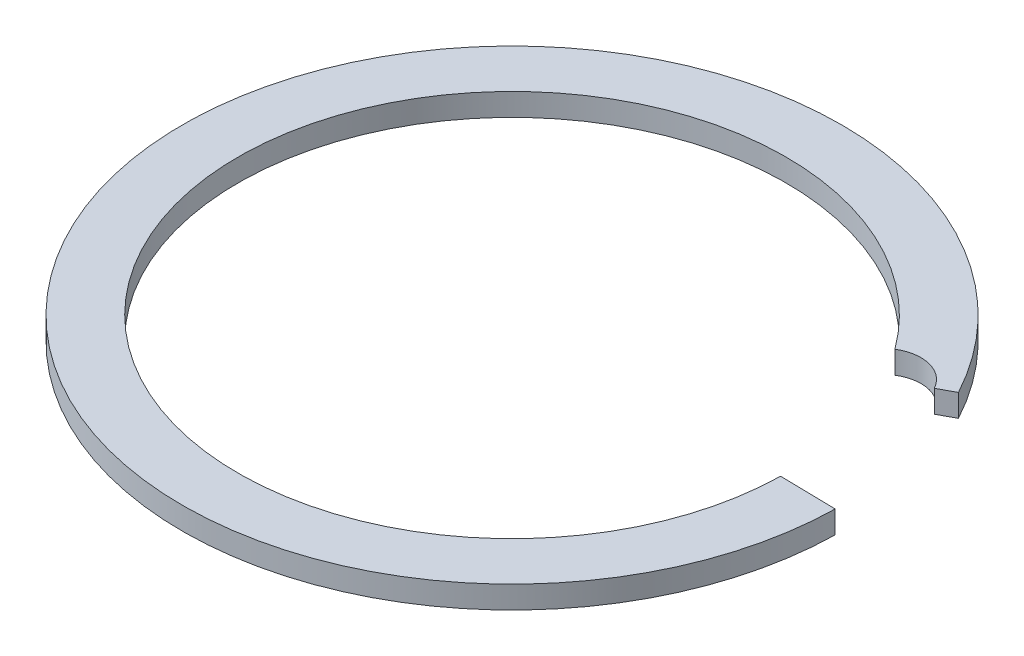
ISO-10303-21;
HEADER;
FILE_DESCRIPTION(('STEP AP214'),'2;1');
FILE_NAME('part.step','',(''),(''),'','','');
FILE_SCHEMA(('AUTOMOTIVE_DESIGN { 1 0 10303 214 1 1 1 1 }'));
ENDSEC;
DATA;
#1=APPLICATION_CONTEXT('core data for automotive mechanical design processes');
#2=APPLICATION_PROTOCOL_DEFINITION('international standard','automotive_design',2000,#1);
#3=PRODUCT_CONTEXT('',#1,'mechanical');
#4=PRODUCT('Part','Part','',(#3));
#5=PRODUCT_RELATED_PRODUCT_CATEGORY('part','',(#4));
#6=PRODUCT_DEFINITION_FORMATION('','',#4);
#7=PRODUCT_DEFINITION_CONTEXT('part definition',#1,'design');
#8=PRODUCT_DEFINITION('design','',#6,#7);
#9=PRODUCT_DEFINITION_SHAPE('','',#8);
#10=(LENGTH_UNIT() NAMED_UNIT(*) SI_UNIT(.MILLI.,.METRE.));
#11=(NAMED_UNIT(*) PLANE_ANGLE_UNIT() SI_UNIT($,.RADIAN.));
#12=(NAMED_UNIT(*) SI_UNIT($,.STERADIAN.) SOLID_ANGLE_UNIT());
#13=UNCERTAINTY_MEASURE_WITH_UNIT(LENGTH_MEASURE(1.E-05),#10,'distance_accuracy_value','');
#14=(GEOMETRIC_REPRESENTATION_CONTEXT(3) GLOBAL_UNCERTAINTY_ASSIGNED_CONTEXT((#13)) GLOBAL_UNIT_ASSIGNED_CONTEXT((#10,
#11,#12)) REPRESENTATION_CONTEXT('',''));
#15=CARTESIAN_POINT('',(0.,0.,0.));
#16=DIRECTION('',(0.,0.,1.));
#17=DIRECTION('',(1.,0.,0.));
#18=AXIS2_PLACEMENT_3D('',#15,#16,#17);
#19=CARTESIAN_POINT('',(0.,0.,0.));
#20=DIRECTION('',(0.,1.,0.));
#21=DIRECTION('',(0.,0.,1.));
#22=AXIS2_PLACEMENT_3D('',#19,#20,#21);
#23=PLANE('',#22);
#24=CARTESIAN_POINT('',(4.94008165912044,0.,-2.65851334418728));
#25=DIRECTION('',(0.,-1.,0.));
#26=DIRECTION('',(0.,0.,-1.));
#27=AXIS2_PLACEMENT_3D('',#24,#25,#26);
#28=CIRCLE('',#27,0.774944932939317);
#29=CARTESIAN_POINT('',(5.6224865165254,0.,-3.02575067845278));
#30=VERTEX_POINT('',#29);
#31=CARTESIAN_POINT('',(4.52658885017397,0.,-3.31392416652535));
#32=VERTEX_POINT('',#31);
#33=EDGE_CURVE('E19',#30,#32,#28,.F.);
#34=ORIENTED_EDGE('',*,*,#33,.T.);
#35=CARTESIAN_POINT('',(0.,0.,0.));
#36=DIRECTION('',(0.,-1.,0.));
#37=DIRECTION('',(0.,0.,-1.));
#38=AXIS2_PLACEMENT_3D('',#35,#36,#37);
#39=CIRCLE('',#38,5.61);
#40=CARTESIAN_POINT('',(5.60895686522467,0.,0.108179868964147));
#41=VERTEX_POINT('',#40);
#42=EDGE_CURVE('E64',#32,#41,#39,.F.);
#43=ORIENTED_EDGE('',*,*,#42,.T.);
#44=DIRECTION('',(-0.999814057972311,0.,-0.0192833991023445));
#45=VECTOR('',#44,1.);
#46=CARTESIAN_POINT('',(5.60895686522467,0.,0.108179868964146));
#47=LINE('',#46,#45);
#48=CARTESIAN_POINT('',(6.7487448913131,0.,0.130162943940819));
#49=VERTEX_POINT('',#48);
#50=EDGE_CURVE('E81',#49,#41,#47,.T.);
#51=ORIENTED_EDGE('',*,*,#50,.F.);
#52=CARTESIAN_POINT('',(0.,0.,0.));
#53=DIRECTION('',(0.,-1.,0.));
#54=DIRECTION('',(0.,0.,-1.));
#55=AXIS2_PLACEMENT_3D('',#52,#53,#54);
#56=CIRCLE('',#55,6.75);
#57=CARTESIAN_POINT('',(5.94394852033208,0.,-3.19874600236437));
#58=VERTEX_POINT('',#57);
#59=EDGE_CURVE('E84',#58,#49,#56,.F.);
#60=ORIENTED_EDGE('',*,*,#59,.F.);
#61=DIRECTION('',(0.880584965975123,0.,-0.473888296646573));
#62=VECTOR('',#61,1.);
#63=CARTESIAN_POINT('',(5.94394852033208,0.,-3.19874600236437));
#64=LINE('',#63,#62);
#65=EDGE_CURVE('E67',#30,#58,#64,.T.);
#66=ORIENTED_EDGE('',*,*,#65,.F.);
#67=EDGE_LOOP('',(#34,#43,#51,#60,#66));
#68=FACE_BOUND('',#67,.T.);
#69=ADVANCED_FACE('F16',(#68),#23,.F.);
#70=CARTESIAN_POINT('',(4.94008165912044,0.46,-2.65851334418728));
#71=DIRECTION('',(0.,-1.,0.));
#72=DIRECTION('',(0.,0.,-1.));
#73=AXIS2_PLACEMENT_3D('',#70,#71,#72);
#74=CYLINDRICAL_SURFACE('',#73,0.774944932939317);
#75=DIRECTION('',(0.,1.,0.));
#76=VECTOR('',#75,1.);
#77=CARTESIAN_POINT('',(5.6224865165254,0.46,-3.02575067845278));
#78=LINE('',#77,#76);
#79=CARTESIAN_POINT('',(5.6224865165254,0.46,-3.02575067845278));
#80=VERTEX_POINT('',#79);
#81=EDGE_CURVE('E69',#80,#30,#78,.F.);
#82=ORIENTED_EDGE('',*,*,#81,.F.);
#83=CARTESIAN_POINT('',(4.94008165912044,0.46,-2.65851334418728));
#84=DIRECTION('',(0.,-1.,0.));
#85=DIRECTION('',(0.,0.,-1.));
#86=AXIS2_PLACEMENT_3D('',#83,#84,#85);
#87=CIRCLE('',#86,0.774944932939317);
#88=CARTESIAN_POINT('',(4.52658885017397,0.46,-3.31392416652535));
#89=VERTEX_POINT('',#88);
#90=EDGE_CURVE('E76',#89,#80,#87,.T.);
#91=ORIENTED_EDGE('',*,*,#90,.F.);
#92=DIRECTION('',(0.,-1.,0.));
#93=VECTOR('',#92,1.);
#94=CARTESIAN_POINT('',(4.52658885017397,0.46,-3.31392416652535));
#95=LINE('',#94,#93);
#96=EDGE_CURVE('E70',#32,#89,#95,.F.);
#97=ORIENTED_EDGE('',*,*,#96,.F.);
#98=ORIENTED_EDGE('',*,*,#33,.F.);
#99=EDGE_LOOP('',(#82,#91,#97,#98));
#100=FACE_BOUND('',#99,.T.);
#101=ADVANCED_FACE('F75',(#100),#74,.F.);
#102=CARTESIAN_POINT('',(5.94394852033208,0.46,-3.19874600236437));
#103=DIRECTION('',(0.473888296646573,0.,0.880584965975123));
#104=DIRECTION('',(0.880584965975123,0.,-0.473888296646573));
#105=AXIS2_PLACEMENT_3D('',#102,#103,#104);
#106=PLANE('',#105);
#107=ORIENTED_EDGE('',*,*,#65,.T.);
#108=DIRECTION('',(0.,-1.,0.));
#109=VECTOR('',#108,1.);
#110=CARTESIAN_POINT('',(5.94394852033208,0.46,-3.19874600236437));
#111=LINE('',#110,#109);
#112=CARTESIAN_POINT('',(5.94394852033208,0.46,-3.19874600236437));
#113=VERTEX_POINT('',#112);
#114=EDGE_CURVE('E86',#113,#58,#111,.T.);
#115=ORIENTED_EDGE('',*,*,#114,.F.);
#116=DIRECTION('',(0.880584965975123,0.,-0.473888296646574));
#117=VECTOR('',#116,1.);
#118=CARTESIAN_POINT('',(5.6224865165254,0.46,-3.02575067845278));
#119=LINE('',#118,#117);
#120=EDGE_CURVE('E88',#80,#113,#119,.T.);
#121=ORIENTED_EDGE('',*,*,#120,.F.);
#122=ORIENTED_EDGE('',*,*,#81,.T.);
#123=EDGE_LOOP('',(#107,#115,#121,#122));
#124=FACE_BOUND('',#123,.T.);
#125=ADVANCED_FACE('F104',(#124),#106,.T.);
#126=CARTESIAN_POINT('',(0.,0.46,0.));
#127=DIRECTION('',(0.,-1.,0.));
#128=DIRECTION('',(0.,0.,-1.));
#129=AXIS2_PLACEMENT_3D('',#126,#127,#128);
#130=CYLINDRICAL_SURFACE('',#129,6.75);
#131=ORIENTED_EDGE('',*,*,#59,.T.);
#132=DIRECTION('',(0.,1.,0.));
#133=VECTOR('',#132,1.);
#134=CARTESIAN_POINT('',(6.7487448913131,0.46,0.130162943940819));
#135=LINE('',#134,#133);
#136=CARTESIAN_POINT('',(6.7487448913131,0.46,0.130162943940819));
#137=VERTEX_POINT('',#136);
#138=EDGE_CURVE('E83',#137,#49,#135,.F.);
#139=ORIENTED_EDGE('',*,*,#138,.F.);
#140=CARTESIAN_POINT('',(0.,0.46,0.));
#141=DIRECTION('',(0.,-1.,0.));
#142=DIRECTION('',(0.,0.,-1.));
#143=AXIS2_PLACEMENT_3D('',#140,#141,#142);
#144=CIRCLE('',#143,6.75);
#145=EDGE_CURVE('E25',#113,#137,#144,.F.);
#146=ORIENTED_EDGE('',*,*,#145,.F.);
#147=ORIENTED_EDGE('',*,*,#114,.T.);
#148=EDGE_LOOP('',(#131,#139,#146,#147));
#149=FACE_BOUND('',#148,.T.);
#150=ADVANCED_FACE('F105',(#149),#130,.T.);
#151=CARTESIAN_POINT('',(5.60895686522467,0.46,0.108179868964146));
#152=DIRECTION('',(0.0192833991023445,0.,-0.999814057972311));
#153=DIRECTION('',(-0.999814057972311,0.,-0.0192833991023445));
#154=AXIS2_PLACEMENT_3D('',#151,#152,#153);
#155=PLANE('',#154);
#156=DIRECTION('',(-0.999814057972311,0.,-0.0192833991023445));
#157=VECTOR('',#156,1.);
#158=CARTESIAN_POINT('',(6.7487448913131,0.46,0.130162943940819));
#159=LINE('',#158,#157);
#160=CARTESIAN_POINT('',(5.60895686522466,0.46,0.108179868964147));
#161=VERTEX_POINT('',#160);
#162=EDGE_CURVE('E11',#137,#161,#159,.T.);
#163=ORIENTED_EDGE('',*,*,#162,.F.);
#164=ORIENTED_EDGE('',*,*,#138,.T.);
#165=ORIENTED_EDGE('',*,*,#50,.T.);
#166=DIRECTION('',(0.,-1.,0.));
#167=VECTOR('',#166,1.);
#168=CARTESIAN_POINT('',(5.60895686522467,0.46,0.108179868964147));
#169=LINE('',#168,#167);
#170=EDGE_CURVE('E73',#41,#161,#169,.F.);
#171=ORIENTED_EDGE('',*,*,#170,.T.);
#172=EDGE_LOOP('',(#163,#164,#165,#171));
#173=FACE_BOUND('',#172,.T.);
#174=ADVANCED_FACE('F108',(#173),#155,.T.);
#175=CARTESIAN_POINT('',(0.,0.46,0.));
#176=DIRECTION('',(0.,-1.,0.));
#177=DIRECTION('',(0.,0.,-1.));
#178=AXIS2_PLACEMENT_3D('',#175,#176,#177);
#179=CYLINDRICAL_SURFACE('',#178,5.61);
#180=CARTESIAN_POINT('',(0.,0.46,0.));
#181=DIRECTION('',(0.,-1.,0.));
#182=DIRECTION('',(0.,0.,-1.));
#183=AXIS2_PLACEMENT_3D('',#180,#181,#182);
#184=CIRCLE('',#183,5.61);
#185=EDGE_CURVE('E34',#161,#89,#184,.T.);
#186=ORIENTED_EDGE('',*,*,#185,.F.);
#187=ORIENTED_EDGE('',*,*,#170,.F.);
#188=ORIENTED_EDGE('',*,*,#42,.F.);
#189=ORIENTED_EDGE('',*,*,#96,.T.);
#190=EDGE_LOOP('',(#186,#187,#188,#189));
#191=FACE_BOUND('',#190,.T.);
#192=ADVANCED_FACE('F71',(#191),#179,.F.);
#193=CARTESIAN_POINT('',(0.,0.46,0.));
#194=DIRECTION('',(0.,1.,0.));
#195=DIRECTION('',(0.,0.,1.));
#196=AXIS2_PLACEMENT_3D('',#193,#194,#195);
#197=PLANE('',#196);
#198=ORIENTED_EDGE('',*,*,#162,.T.);
#199=ORIENTED_EDGE('',*,*,#185,.T.);
#200=ORIENTED_EDGE('',*,*,#90,.T.);
#201=ORIENTED_EDGE('',*,*,#120,.T.);
#202=ORIENTED_EDGE('',*,*,#145,.T.);
#203=EDGE_LOOP('',(#198,#199,#200,#201,#202));
#204=FACE_BOUND('',#203,.T.);
#205=ADVANCED_FACE('F102',(#204),#197,.T.);
#206=CLOSED_SHELL('',(#69,#101,#125,#150,#174,#192,#205));
#207=MANIFOLD_SOLID_BREP('B1',#206);
#208=ADVANCED_BREP_SHAPE_REPRESENTATION('',(#18,#207),#14);
#209=SHAPE_DEFINITION_REPRESENTATION(#9,#208);
ENDSEC;
END-ISO-10303-21;
